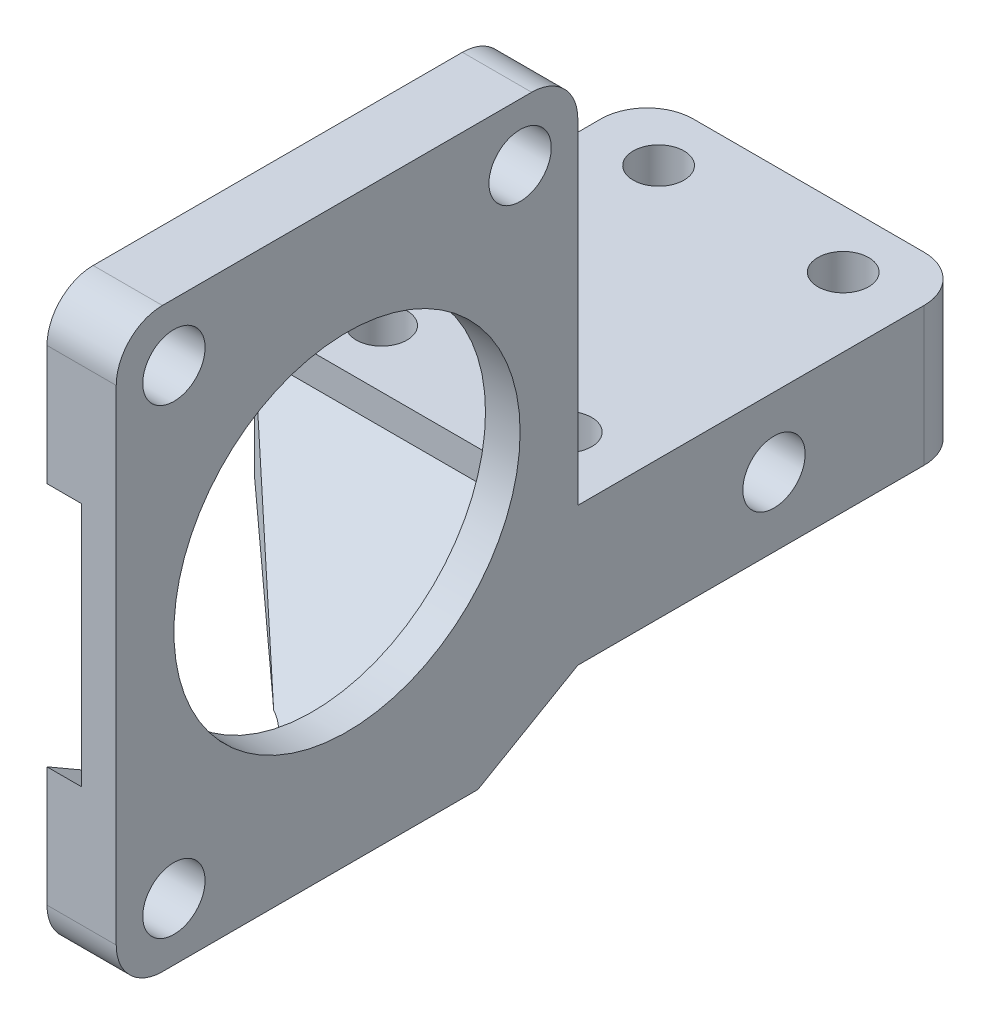
ISO-10303-21;
HEADER;
FILE_DESCRIPTION(('STEP AP214'),'2;1');
FILE_NAME('part.step','',(''),(''),'','','');
FILE_SCHEMA(('AUTOMOTIVE_DESIGN { 1 0 10303 214 1 1 1 1 }'));
ENDSEC;
DATA;
#1=APPLICATION_CONTEXT('core data for automotive mechanical design processes');
#2=APPLICATION_PROTOCOL_DEFINITION('international standard','automotive_design',2000,#1);
#3=PRODUCT_CONTEXT('',#1,'mechanical');
#4=PRODUCT('Part','Part','',(#3));
#5=PRODUCT_RELATED_PRODUCT_CATEGORY('part','',(#4));
#6=PRODUCT_DEFINITION_FORMATION('','',#4);
#7=PRODUCT_DEFINITION_CONTEXT('part definition',#1,'design');
#8=PRODUCT_DEFINITION('design','',#6,#7);
#9=PRODUCT_DEFINITION_SHAPE('','',#8);
#10=(LENGTH_UNIT() NAMED_UNIT(*) SI_UNIT(.MILLI.,.METRE.));
#11=(NAMED_UNIT(*) PLANE_ANGLE_UNIT() SI_UNIT($,.RADIAN.));
#12=(NAMED_UNIT(*) SI_UNIT($,.STERADIAN.) SOLID_ANGLE_UNIT());
#13=UNCERTAINTY_MEASURE_WITH_UNIT(LENGTH_MEASURE(1.E-05),#10,'distance_accuracy_value','');
#14=(GEOMETRIC_REPRESENTATION_CONTEXT(3) GLOBAL_UNCERTAINTY_ASSIGNED_CONTEXT((#13)) GLOBAL_UNIT_ASSIGNED_CONTEXT((#10,
#11,#12)) REPRESENTATION_CONTEXT('',''));
#15=CARTESIAN_POINT('',(0.,0.,0.));
#16=DIRECTION('',(0.,0.,1.));
#17=DIRECTION('',(1.,0.,0.));
#18=AXIS2_PLACEMENT_3D('',#15,#16,#17);
#19=CARTESIAN_POINT('',(0.,6.,0.));
#20=DIRECTION('',(0.,-1.,0.));
#21=DIRECTION('',(0.,0.,-1.));
#22=AXIS2_PLACEMENT_3D('',#19,#20,#21);
#23=PLANE('',#22);
#24=CARTESIAN_POINT('',(-4.,6.,6.));
#25=DIRECTION('',(0.,1.,0.));
#26=DIRECTION('',(0.,0.,-1.));
#27=AXIS2_PLACEMENT_3D('',#24,#25,#26);
#28=CIRCLE('',#27,1.1);
#29=CARTESIAN_POINT('',(-4.,6.,4.9));
#30=VERTEX_POINT('',#29);
#31=EDGE_CURVE('E321',#30,#30,#28,.T.);
#32=ORIENTED_EDGE('',*,*,#31,.F.);
#33=EDGE_LOOP('',(#32));
#34=FACE_BOUND('',#33,.T.);
#35=CARTESIAN_POINT('',(4.,6.,6.));
#36=DIRECTION('',(0.,1.,0.));
#37=DIRECTION('',(0.,0.,1.));
#38=AXIS2_PLACEMENT_3D('',#35,#36,#37);
#39=CIRCLE('',#38,1.1);
#40=CARTESIAN_POINT('',(4.,6.,7.1));
#41=VERTEX_POINT('',#40);
#42=EDGE_CURVE('E327',#41,#41,#39,.T.);
#43=ORIENTED_EDGE('',*,*,#42,.F.);
#44=EDGE_LOOP('',(#43));
#45=FACE_BOUND('',#44,.T.);
#46=CARTESIAN_POINT('',(4.,6.,-6.));
#47=DIRECTION('',(0.,1.,0.));
#48=DIRECTION('',(0.,0.,-1.));
#49=AXIS2_PLACEMENT_3D('',#46,#47,#48);
#50=CIRCLE('',#49,1.1);
#51=CARTESIAN_POINT('',(4.,6.,-7.1));
#52=VERTEX_POINT('',#51);
#53=EDGE_CURVE('E333',#52,#52,#50,.T.);
#54=ORIENTED_EDGE('',*,*,#53,.F.);
#55=EDGE_LOOP('',(#54));
#56=FACE_BOUND('',#55,.T.);
#57=CARTESIAN_POINT('',(-4.,6.,-6.));
#58=DIRECTION('',(0.,1.,0.));
#59=DIRECTION('',(0.,0.,1.));
#60=AXIS2_PLACEMENT_3D('',#57,#58,#59);
#61=CIRCLE('',#60,1.1);
#62=CARTESIAN_POINT('',(-4.,6.,-4.9));
#63=VERTEX_POINT('',#62);
#64=EDGE_CURVE('E207',#63,#63,#61,.T.);
#65=ORIENTED_EDGE('',*,*,#64,.F.);
#66=EDGE_LOOP('',(#65));
#67=FACE_BOUND('',#66,.T.);
#68=DIRECTION('',(0.,0.,-1.));
#69=VECTOR('',#68,1.);
#70=CARTESIAN_POINT('',(7.,6.,8.5));
#71=LINE('',#70,#69);
#72=CARTESIAN_POINT('',(7.,6.,8.5));
#73=VERTEX_POINT('',#72);
#74=CARTESIAN_POINT('',(7.,6.,-6.5));
#75=VERTEX_POINT('',#74);
#76=EDGE_CURVE('E190',#73,#75,#71,.T.);
#77=ORIENTED_EDGE('',*,*,#76,.T.);
#78=CARTESIAN_POINT('',(5.,6.,-6.5));
#79=DIRECTION('',(0.,-1.,0.));
#80=DIRECTION('',(0.,0.,-1.));
#81=AXIS2_PLACEMENT_3D('',#78,#79,#80);
#82=CIRCLE('',#81,2.);
#83=CARTESIAN_POINT('',(5.,6.,-8.5));
#84=VERTEX_POINT('',#83);
#85=EDGE_CURVE('E255',#75,#84,#82,.F.);
#86=ORIENTED_EDGE('',*,*,#85,.T.);
#87=DIRECTION('',(-1.,0.,0.));
#88=VECTOR('',#87,1.);
#89=CARTESIAN_POINT('',(-7.,6.,-8.5));
#90=LINE('',#89,#88);
#91=CARTESIAN_POINT('',(-5.,6.,-8.5));
#92=VERTEX_POINT('',#91);
#93=EDGE_CURVE('E342',#84,#92,#90,.T.);
#94=ORIENTED_EDGE('',*,*,#93,.T.);
#95=CARTESIAN_POINT('',(-5.,6.,-6.5));
#96=DIRECTION('',(0.,-1.,0.));
#97=DIRECTION('',(0.,0.,-1.));
#98=AXIS2_PLACEMENT_3D('',#95,#96,#97);
#99=CIRCLE('',#98,2.);
#100=CARTESIAN_POINT('',(-7.,6.,-6.5));
#101=VERTEX_POINT('',#100);
#102=EDGE_CURVE('E253',#92,#101,#99,.F.);
#103=ORIENTED_EDGE('',*,*,#102,.T.);
#104=DIRECTION('',(0.,0.,1.));
#105=VECTOR('',#104,1.);
#106=CARTESIAN_POINT('',(-7.,6.,8.5));
#107=LINE('',#106,#105);
#108=CARTESIAN_POINT('',(-7.,6.,8.5));
#109=VERTEX_POINT('',#108);
#110=EDGE_CURVE('E344',#101,#109,#107,.T.);
#111=ORIENTED_EDGE('',*,*,#110,.T.);
#112=DIRECTION('',(1.,0.,0.));
#113=VECTOR('',#112,1.);
#114=CARTESIAN_POINT('',(-7.,6.,8.5));
#115=LINE('',#114,#113);
#116=CARTESIAN_POINT('',(5.5,6.,8.5));
#117=VERTEX_POINT('',#116);
#118=EDGE_CURVE('E215',#109,#117,#115,.T.);
#119=ORIENTED_EDGE('',*,*,#118,.T.);
#120=EDGE_CURVE('E345',#117,#73,#115,.T.);
#121=ORIENTED_EDGE('',*,*,#120,.T.);
#122=EDGE_LOOP('',(#77,#86,#94,#103,#111,#119,#121));
#123=FACE_BOUND('',#122,.T.);
#124=ADVANCED_FACE('F34',(#34,#45,#56,#67,#123),#23,.F.);
#125=CARTESIAN_POINT('',(0.,0.,0.));
#126=DIRECTION('',(0.,-1.,0.));
#127=DIRECTION('',(0.,0.,-1.));
#128=AXIS2_PLACEMENT_3D('',#125,#126,#127);
#129=PLANE('',#128);
#130=CARTESIAN_POINT('',(4.,0.,6.));
#131=DIRECTION('',(0.,1.,0.));
#132=DIRECTION('',(0.,0.,1.));
#133=AXIS2_PLACEMENT_3D('',#130,#131,#132);
#134=CIRCLE('',#133,1.1);
#135=CARTESIAN_POINT('',(4.,0.,7.1));
#136=VERTEX_POINT('',#135);
#137=EDGE_CURVE('E324',#136,#136,#134,.T.);
#138=ORIENTED_EDGE('',*,*,#137,.T.);
#139=EDGE_LOOP('',(#138));
#140=FACE_BOUND('',#139,.T.);
#141=CARTESIAN_POINT('',(-4.,0.,-6.));
#142=DIRECTION('',(0.,1.,0.));
#143=DIRECTION('',(0.,0.,1.));
#144=AXIS2_PLACEMENT_3D('',#141,#142,#143);
#145=CIRCLE('',#144,1.1);
#146=CARTESIAN_POINT('',(-4.,0.,-4.9));
#147=VERTEX_POINT('',#146);
#148=EDGE_CURVE('E212',#147,#147,#145,.T.);
#149=ORIENTED_EDGE('',*,*,#148,.T.);
#150=EDGE_LOOP('',(#149));
#151=FACE_BOUND('',#150,.T.);
#152=CARTESIAN_POINT('',(4.,0.,-6.));
#153=DIRECTION('',(0.,1.,0.));
#154=DIRECTION('',(0.,0.,-1.));
#155=AXIS2_PLACEMENT_3D('',#152,#153,#154);
#156=CIRCLE('',#155,1.1);
#157=CARTESIAN_POINT('',(4.,0.,-7.1));
#158=VERTEX_POINT('',#157);
#159=EDGE_CURVE('E330',#158,#158,#156,.T.);
#160=ORIENTED_EDGE('',*,*,#159,.T.);
#161=EDGE_LOOP('',(#160));
#162=FACE_BOUND('',#161,.T.);
#163=CARTESIAN_POINT('',(-4.,0.,6.));
#164=DIRECTION('',(0.,1.,0.));
#165=DIRECTION('',(0.,0.,-1.));
#166=AXIS2_PLACEMENT_3D('',#163,#164,#165);
#167=CIRCLE('',#166,1.1);
#168=CARTESIAN_POINT('',(-4.,0.,4.9));
#169=VERTEX_POINT('',#168);
#170=EDGE_CURVE('E302',#169,#169,#167,.T.);
#171=ORIENTED_EDGE('',*,*,#170,.T.);
#172=EDGE_LOOP('',(#171));
#173=FACE_BOUND('',#172,.T.);
#174=DIRECTION('',(1.,0.,0.));
#175=VECTOR('',#174,1.);
#176=CARTESIAN_POINT('',(-7.,0.,8.5));
#177=LINE('',#176,#175);
#178=CARTESIAN_POINT('',(1.5,0.,8.5));
#179=VERTEX_POINT('',#178);
#180=CARTESIAN_POINT('',(7.,0.,8.5));
#181=VERTEX_POINT('',#180);
#182=EDGE_CURVE('E179',#179,#181,#177,.T.);
#183=ORIENTED_EDGE('',*,*,#182,.F.);
#184=DIRECTION('',(0.,0.,1.));
#185=VECTOR('',#184,1.);
#186=CARTESIAN_POINT('',(1.5,0.,16.6205080756888));
#187=LINE('',#186,#185);
#188=CARTESIAN_POINT('',(1.5,0.,16.2272727272727));
#189=VERTEX_POINT('',#188);
#190=EDGE_CURVE('E281',#179,#189,#187,.T.);
#191=ORIENTED_EDGE('',*,*,#190,.T.);
#192=DIRECTION('',(-0.739940073395944,0.,-0.672672793996313));
#193=VECTOR('',#192,1.);
#194=CARTESIAN_POINT('',(-7.,0.,8.5));
#195=LINE('',#194,#193);
#196=CARTESIAN_POINT('',(-7.,0.,8.5));
#197=VERTEX_POINT('',#196);
#198=EDGE_CURVE('E228',#189,#197,#195,.T.);
#199=ORIENTED_EDGE('',*,*,#198,.T.);
#200=DIRECTION('',(0.,0.,1.));
#201=VECTOR('',#200,1.);
#202=CARTESIAN_POINT('',(-7.,0.,8.5));
#203=LINE('',#202,#201);
#204=CARTESIAN_POINT('',(-7.,0.,-6.5));
#205=VERTEX_POINT('',#204);
#206=EDGE_CURVE('E191',#205,#197,#203,.T.);
#207=ORIENTED_EDGE('',*,*,#206,.F.);
#208=CARTESIAN_POINT('',(-5.,0.,-6.5));
#209=DIRECTION('',(0.,-1.,0.));
#210=DIRECTION('',(0.,0.,-1.));
#211=AXIS2_PLACEMENT_3D('',#208,#209,#210);
#212=CIRCLE('',#211,2.);
#213=CARTESIAN_POINT('',(-5.,0.,-8.5));
#214=VERTEX_POINT('',#213);
#215=EDGE_CURVE('E242',#205,#214,#212,.T.);
#216=ORIENTED_EDGE('',*,*,#215,.T.);
#217=DIRECTION('',(-1.,0.,0.));
#218=VECTOR('',#217,1.);
#219=CARTESIAN_POINT('',(-7.,0.,-8.5));
#220=LINE('',#219,#218);
#221=CARTESIAN_POINT('',(5.,0.,-8.5));
#222=VERTEX_POINT('',#221);
#223=EDGE_CURVE('E206',#222,#214,#220,.T.);
#224=ORIENTED_EDGE('',*,*,#223,.F.);
#225=CARTESIAN_POINT('',(5.,0.,-6.5));
#226=DIRECTION('',(0.,-1.,0.));
#227=DIRECTION('',(0.,0.,-1.));
#228=AXIS2_PLACEMENT_3D('',#225,#226,#227);
#229=CIRCLE('',#228,2.);
#230=CARTESIAN_POINT('',(7.,0.,-6.5));
#231=VERTEX_POINT('',#230);
#232=EDGE_CURVE('E205',#222,#231,#229,.T.);
#233=ORIENTED_EDGE('',*,*,#232,.T.);
#234=DIRECTION('',(0.,0.,-1.));
#235=VECTOR('',#234,1.);
#236=CARTESIAN_POINT('',(7.,0.,8.5));
#237=LINE('',#236,#235);
#238=EDGE_CURVE('E197',#181,#231,#237,.T.);
#239=ORIENTED_EDGE('',*,*,#238,.F.);
#240=EDGE_LOOP('',(#183,#191,#199,#207,#216,#224,#233,#239));
#241=FACE_BOUND('',#240,.T.);
#242=ADVANCED_FACE('F203',(#140,#151,#162,#173,#241),#129,.T.);
#243=CARTESIAN_POINT('',(4.,-2.5,8.5));
#244=DIRECTION('',(0.,0.,-1.));
#245=DIRECTION('',(-1.,0.,0.));
#246=AXIS2_PLACEMENT_3D('',#243,#244,#245);
#247=PLANE('',#246);
#248=DIRECTION('',(0.,1.,0.));
#249=VECTOR('',#248,1.);
#250=CARTESIAN_POINT('',(4.,-2.5,8.5));
#251=LINE('',#250,#249);
#252=CARTESIAN_POINT('',(4.,15.3116224765446,8.5));
#253=VERTEX_POINT('',#252);
#254=CARTESIAN_POINT('',(4.,20.5,8.5));
#255=VERTEX_POINT('',#254);
#256=EDGE_CURVE('E320',#253,#255,#251,.T.);
#257=ORIENTED_EDGE('',*,*,#256,.T.);
#258=DIRECTION('',(1.,0.,0.));
#259=VECTOR('',#258,1.);
#260=CARTESIAN_POINT('',(4.,20.5,8.5));
#261=LINE('',#260,#259);
#262=CARTESIAN_POINT('',(7.,20.5,8.5));
#263=VERTEX_POINT('',#262);
#264=EDGE_CURVE('E278',#255,#263,#261,.T.);
#265=ORIENTED_EDGE('',*,*,#264,.T.);
#266=DIRECTION('',(0.,1.,0.));
#267=VECTOR('',#266,1.);
#268=CARTESIAN_POINT('',(7.,-2.5,8.5));
#269=LINE('',#268,#267);
#270=EDGE_CURVE('E309',#73,#263,#269,.T.);
#271=ORIENTED_EDGE('',*,*,#270,.F.);
#272=ORIENTED_EDGE('',*,*,#120,.F.);
#273=DIRECTION('',(0.,-1.,0.));
#274=VECTOR('',#273,1.);
#275=CARTESIAN_POINT('',(5.5,15.3116224765446,8.5));
#276=LINE('',#275,#274);
#277=CARTESIAN_POINT('',(5.5,15.3116224765446,8.5));
#278=VERTEX_POINT('',#277);
#279=EDGE_CURVE('E420',#278,#117,#276,.T.);
#280=ORIENTED_EDGE('',*,*,#279,.F.);
#281=DIRECTION('',(1.,0.,0.));
#282=VECTOR('',#281,1.);
#283=CARTESIAN_POINT('',(-7.,15.3116224765446,8.5));
#284=LINE('',#283,#282);
#285=EDGE_CURVE('E435',#253,#278,#284,.T.);
#286=ORIENTED_EDGE('',*,*,#285,.F.);
#287=EDGE_LOOP('',(#257,#265,#271,#272,#280,#286));
#288=FACE_BOUND('',#287,.T.);
#289=ADVANCED_FACE('F453',(#288),#247,.T.);
#290=CARTESIAN_POINT('',(4.,-2.5,28.5));
#291=DIRECTION('',(0.,0.,1.));
#292=DIRECTION('',(0.,-1.,0.));
#293=AXIS2_PLACEMENT_3D('',#290,#291,#292);
#294=PLANE('',#293);
#295=DIRECTION('',(0.,-1.,0.));
#296=VECTOR('',#295,1.);
#297=CARTESIAN_POINT('',(4.,-2.5,28.5));
#298=LINE('',#297,#296);
#299=CARTESIAN_POINT('',(4.,4.68837752345546,28.5));
#300=VERTEX_POINT('',#299);
#301=CARTESIAN_POINT('',(4.,-0.500000000000002,28.5));
#302=VERTEX_POINT('',#301);
#303=EDGE_CURVE('E305',#300,#302,#298,.T.);
#304=ORIENTED_EDGE('',*,*,#303,.T.);
#305=DIRECTION('',(1.,0.,0.));
#306=VECTOR('',#305,1.);
#307=CARTESIAN_POINT('',(4.,-0.500000000000002,28.5));
#308=LINE('',#307,#306);
#309=CARTESIAN_POINT('',(7.,-0.500000000000002,28.5));
#310=VERTEX_POINT('',#309);
#311=EDGE_CURVE('E262',#302,#310,#308,.T.);
#312=ORIENTED_EDGE('',*,*,#311,.T.);
#313=DIRECTION('',(0.,-1.,0.));
#314=VECTOR('',#313,1.);
#315=CARTESIAN_POINT('',(7.,-2.5,28.5));
#316=LINE('',#315,#314);
#317=CARTESIAN_POINT('',(7.,20.5,28.5));
#318=VERTEX_POINT('',#317);
#319=EDGE_CURVE('E316',#318,#310,#316,.T.);
#320=ORIENTED_EDGE('',*,*,#319,.F.);
#321=DIRECTION('',(1.,0.,0.));
#322=VECTOR('',#321,1.);
#323=CARTESIAN_POINT('',(4.,20.5,28.5));
#324=LINE('',#323,#322);
#325=CARTESIAN_POINT('',(4.,20.5,28.5));
#326=VERTEX_POINT('',#325);
#327=EDGE_CURVE('E260',#318,#326,#324,.F.);
#328=ORIENTED_EDGE('',*,*,#327,.T.);
#329=CARTESIAN_POINT('',(4.,15.3116224765446,28.5));
#330=VERTEX_POINT('',#329);
#331=EDGE_CURVE('E304',#326,#330,#298,.T.);
#332=ORIENTED_EDGE('',*,*,#331,.T.);
#333=DIRECTION('',(1.,0.,0.));
#334=VECTOR('',#333,1.);
#335=CARTESIAN_POINT('',(-7.,15.3116224765446,28.5));
#336=LINE('',#335,#334);
#337=CARTESIAN_POINT('',(5.5,15.3116224765446,28.5));
#338=VERTEX_POINT('',#337);
#339=EDGE_CURVE('E229',#330,#338,#336,.T.);
#340=ORIENTED_EDGE('',*,*,#339,.T.);
#341=DIRECTION('',(0.,1.,0.));
#342=VECTOR('',#341,1.);
#343=CARTESIAN_POINT('',(5.5,15.3116224765446,28.5));
#344=LINE('',#343,#342);
#345=CARTESIAN_POINT('',(5.5,4.68837752345546,28.5));
#346=VERTEX_POINT('',#345);
#347=EDGE_CURVE('E408',#346,#338,#344,.T.);
#348=ORIENTED_EDGE('',*,*,#347,.F.);
#349=DIRECTION('',(1.,0.,0.));
#350=VECTOR('',#349,1.);
#351=CARTESIAN_POINT('',(-7.,4.68837752345546,28.5));
#352=LINE('',#351,#350);
#353=EDGE_CURVE('E405',#300,#346,#352,.T.);
#354=ORIENTED_EDGE('',*,*,#353,.F.);
#355=EDGE_LOOP('',(#304,#312,#320,#328,#332,#340,#348,#354));
#356=FACE_BOUND('',#355,.T.);
#357=ADVANCED_FACE('F402',(#356),#294,.T.);
#358=CARTESIAN_POINT('',(4.,0.,0.));
#359=DIRECTION('',(-1.,0.,0.));
#360=DIRECTION('',(0.,0.,1.));
#361=AXIS2_PLACEMENT_3D('',#358,#359,#360);
#362=PLANE('',#361);
#363=CARTESIAN_POINT('',(4.,20.,11.));
#364=DIRECTION('',(1.,0.,0.));
#365=DIRECTION('',(0.,0.,1.));
#366=AXIS2_PLACEMENT_3D('',#363,#364,#365);
#367=CIRCLE('',#366,1.35);
#368=CARTESIAN_POINT('',(4.,20.,12.35));
#369=VERTEX_POINT('',#368);
#370=EDGE_CURVE('E379',#369,#369,#367,.T.);
#371=ORIENTED_EDGE('',*,*,#370,.T.);
#372=EDGE_LOOP('',(#371));
#373=FACE_BOUND('',#372,.T.);
#374=CARTESIAN_POINT('',(4.,20.,26.));
#375=DIRECTION('',(1.,0.,0.));
#376=DIRECTION('',(0.,0.,-1.));
#377=AXIS2_PLACEMENT_3D('',#374,#375,#376);
#378=CIRCLE('',#377,1.35);
#379=CARTESIAN_POINT('',(4.,20.,24.65));
#380=VERTEX_POINT('',#379);
#381=EDGE_CURVE('E385',#380,#380,#378,.T.);
#382=ORIENTED_EDGE('',*,*,#381,.T.);
#383=EDGE_LOOP('',(#382));
#384=FACE_BOUND('',#383,.T.);
#385=ORIENTED_EDGE('',*,*,#331,.F.);
#386=CARTESIAN_POINT('',(4.,20.5,26.5));
#387=DIRECTION('',(-1.,0.,0.));
#388=DIRECTION('',(0.,0.,1.));
#389=AXIS2_PLACEMENT_3D('',#386,#387,#388);
#390=CIRCLE('',#389,2.);
#391=CARTESIAN_POINT('',(4.,22.5,26.5));
#392=VERTEX_POINT('',#391);
#393=EDGE_CURVE('E276',#326,#392,#390,.T.);
#394=ORIENTED_EDGE('',*,*,#393,.T.);
#395=DIRECTION('',(0.,0.,1.));
#396=VECTOR('',#395,1.);
#397=CARTESIAN_POINT('',(4.,22.5,28.5));
#398=LINE('',#397,#396);
#399=CARTESIAN_POINT('',(4.,22.5,10.5));
#400=VERTEX_POINT('',#399);
#401=EDGE_CURVE('E393',#400,#392,#398,.T.);
#402=ORIENTED_EDGE('',*,*,#401,.F.);
#403=CARTESIAN_POINT('',(4.,20.5,10.5));
#404=DIRECTION('',(-1.,0.,0.));
#405=DIRECTION('',(0.,0.,1.));
#406=AXIS2_PLACEMENT_3D('',#403,#404,#405);
#407=CIRCLE('',#406,2.);
#408=EDGE_CURVE('E274',#400,#255,#407,.T.);
#409=ORIENTED_EDGE('',*,*,#408,.T.);
#410=ORIENTED_EDGE('',*,*,#256,.F.);
#411=DIRECTION('',(0.,0.499999999999994,0.866025403784442));
#412=VECTOR('',#411,1.);
#413=CARTESIAN_POINT('',(4.,7.80310889132468,-4.5051270189222));
#414=LINE('',#413,#412);
#415=CARTESIAN_POINT('',(4.,21.0851251684408,18.5));
#416=VERTEX_POINT('',#415);
#417=EDGE_CURVE('E231',#253,#416,#414,.T.);
#418=ORIENTED_EDGE('',*,*,#417,.T.);
#419=DIRECTION('',(0.,-0.5,0.866025403784439));
#420=VECTOR('',#419,1.);
#421=CARTESIAN_POINT('',(4.,23.8245788613367,13.7551270189222));
#422=LINE('',#421,#420);
#423=EDGE_CURVE('E234',#416,#330,#422,.T.);
#424=ORIENTED_EDGE('',*,*,#423,.T.);
#425=EDGE_LOOP('',(#385,#394,#402,#409,#410,#418,#424));
#426=FACE_BOUND('',#425,.T.);
#427=ADVANCED_FACE('F444',(#373,#384,#426),#362,.T.);
#428=DIRECTION('',(0.,-0.500000000000018,-0.866025403784428));
#429=VECTOR('',#428,1.);
#430=CARTESIAN_POINT('',(4.,-8.82457886133705,5.09487298107827));
#431=LINE('',#430,#429);
#432=CARTESIAN_POINT('',(4.,-1.08512516844081,18.5));
#433=VERTEX_POINT('',#432);
#434=EDGE_CURVE('E224',#300,#433,#431,.T.);
#435=ORIENTED_EDGE('',*,*,#434,.T.);
#436=DIRECTION('',(0.,-0.5,0.866025403784439));
#437=VECTOR('',#436,1.);
#438=CARTESIAN_POINT('',(4.,4.45743741577959,8.9));
#439=LINE('',#438,#437);
#440=CARTESIAN_POINT('',(4.,-2.5,20.950635094611));
#441=VERTEX_POINT('',#440);
#442=EDGE_CURVE('E49',#433,#441,#439,.T.);
#443=ORIENTED_EDGE('',*,*,#442,.T.);
#444=DIRECTION('',(0.,0.,-1.));
#445=VECTOR('',#444,1.);
#446=CARTESIAN_POINT('',(4.,-2.5,28.5));
#447=LINE('',#446,#445);
#448=CARTESIAN_POINT('',(4.,-2.5,26.5));
#449=VERTEX_POINT('',#448);
#450=EDGE_CURVE('E294',#449,#441,#447,.T.);
#451=ORIENTED_EDGE('',*,*,#450,.F.);
#452=CARTESIAN_POINT('',(4.,-0.500000000000001,26.5));
#453=DIRECTION('',(-1.,0.,0.));
#454=DIRECTION('',(0.,0.,1.));
#455=AXIS2_PLACEMENT_3D('',#452,#453,#454);
#456=CIRCLE('',#455,2.);
#457=EDGE_CURVE('E267',#449,#302,#456,.T.);
#458=ORIENTED_EDGE('',*,*,#457,.T.);
#459=ORIENTED_EDGE('',*,*,#303,.F.);
#460=EDGE_LOOP('',(#435,#443,#451,#458,#459));
#461=FACE_BOUND('',#460,.T.);
#462=CARTESIAN_POINT('',(4.,0.,26.));
#463=DIRECTION('',(1.,0.,0.));
#464=DIRECTION('',(0.,0.,1.));
#465=AXIS2_PLACEMENT_3D('',#462,#463,#464);
#466=CIRCLE('',#465,1.35);
#467=CARTESIAN_POINT('',(4.,0.,27.35));
#468=VERTEX_POINT('',#467);
#469=EDGE_CURVE('E373',#468,#468,#466,.T.);
#470=ORIENTED_EDGE('',*,*,#469,.T.);
#471=EDGE_LOOP('',(#470));
#472=FACE_BOUND('',#471,.T.);
#473=ADVANCED_FACE('F292',(#461,#472),#362,.T.);
#474=CARTESIAN_POINT('',(-7.,20.8660687473185,8.5));
#475=DIRECTION('',(-0.672672793996313,0.,0.739940073395943));
#476=DIRECTION('',(0.739940073395944,0.,0.672672793996313));
#477=AXIS2_PLACEMENT_3D('',#474,#475,#476);
#478=PLANE('',#477);
#479=ORIENTED_EDGE('',*,*,#198,.F.);
#480=CARTESIAN_POINT('',(1.5,-2.5,16.2272727272727));
#481=DIRECTION('',(-0.672672793996313,0.,0.739940073395943));
#482=DIRECTION('',(-0.739940073395944,0.,-0.672672793996313));
#483=AXIS2_PLACEMENT_3D('',#480,#481,#482);
#484=ELLIPSE('',#483,3.37865198802693,2.5);
#485=CARTESIAN_POINT('',(2.04869741282572,-0.0609569193721965,16.7260885571143));
#486=VERTEX_POINT('',#485);
#487=EDGE_CURVE('E284',#189,#486,#484,.F.);
#488=ORIENTED_EDGE('',*,*,#487,.T.);
#489=DIRECTION('',(-0.689748942872674,0.362024307127999,-0.627044493520613));
#490=VECTOR('',#489,1.);
#491=CARTESIAN_POINT('',(-11.0396646741522,6.80865160259871,4.82757756895256));
#492=LINE('',#491,#490);
#493=CARTESIAN_POINT('',(-7.,4.68837752345545,8.5));
#494=VERTEX_POINT('',#493);
#495=EDGE_CURVE('E55',#486,#494,#492,.T.);
#496=ORIENTED_EDGE('',*,*,#495,.T.);
#497=DIRECTION('',(0.,-1.,0.));
#498=VECTOR('',#497,1.);
#499=CARTESIAN_POINT('',(-7.,6.,8.5));
#500=LINE('',#499,#498);
#501=EDGE_CURVE('E222',#494,#197,#500,.T.);
#502=ORIENTED_EDGE('',*,*,#501,.T.);
#503=EDGE_LOOP('',(#479,#488,#496,#502));
#504=FACE_BOUND('',#503,.T.);
#505=ADVANCED_FACE('F356',(#504),#478,.T.);
#506=CARTESIAN_POINT('',(7.,6.,8.5));
#507=DIRECTION('',(-1.,0.,0.));
#508=DIRECTION('',(0.,0.,1.));
#509=AXIS2_PLACEMENT_3D('',#506,#507,#508);
#510=PLANE('',#509);
#511=CARTESIAN_POINT('',(7.,3.,0.));
#512=DIRECTION('',(1.,0.,0.));
#513=DIRECTION('',(0.,0.,1.));
#514=AXIS2_PLACEMENT_3D('',#511,#512,#513);
#515=CIRCLE('',#514,1.35);
#516=CARTESIAN_POINT('',(7.,3.,1.35));
#517=VERTEX_POINT('',#516);
#518=EDGE_CURVE('E362',#517,#517,#515,.T.);
#519=ORIENTED_EDGE('',*,*,#518,.F.);
#520=EDGE_LOOP('',(#519));
#521=FACE_BOUND('',#520,.T.);
#522=ORIENTED_EDGE('',*,*,#238,.T.);
#523=DIRECTION('',(0.,-1.,0.));
#524=VECTOR('',#523,1.);
#525=CARTESIAN_POINT('',(7.,6.,-6.5));
#526=LINE('',#525,#524);
#527=EDGE_CURVE('E251',#231,#75,#526,.F.);
#528=ORIENTED_EDGE('',*,*,#527,.T.);
#529=ORIENTED_EDGE('',*,*,#76,.F.);
#530=ORIENTED_EDGE('',*,*,#270,.T.);
#531=CARTESIAN_POINT('',(7.,20.5,10.5));
#532=DIRECTION('',(-1.,0.,0.));
#533=DIRECTION('',(0.,0.,1.));
#534=AXIS2_PLACEMENT_3D('',#531,#532,#533);
#535=CIRCLE('',#534,2.);
#536=CARTESIAN_POINT('',(7.,22.5,10.5));
#537=VERTEX_POINT('',#536);
#538=EDGE_CURVE('E245',#263,#537,#535,.F.);
#539=ORIENTED_EDGE('',*,*,#538,.T.);
#540=DIRECTION('',(0.,0.,1.));
#541=VECTOR('',#540,1.);
#542=CARTESIAN_POINT('',(7.,22.5,28.5));
#543=LINE('',#542,#541);
#544=CARTESIAN_POINT('',(7.,22.5,26.5));
#545=VERTEX_POINT('',#544);
#546=EDGE_CURVE('E312',#537,#545,#543,.T.);
#547=ORIENTED_EDGE('',*,*,#546,.T.);
#548=CARTESIAN_POINT('',(7.,20.5,26.5));
#549=DIRECTION('',(-1.,0.,0.));
#550=DIRECTION('',(0.,0.,1.));
#551=AXIS2_PLACEMENT_3D('',#548,#549,#550);
#552=CIRCLE('',#551,2.);
#553=EDGE_CURVE('E247',#545,#318,#552,.F.);
#554=ORIENTED_EDGE('',*,*,#553,.T.);
#555=ORIENTED_EDGE('',*,*,#319,.T.);
#556=CARTESIAN_POINT('',(7.,-0.500000000000001,26.5));
#557=DIRECTION('',(-1.,0.,0.));
#558=DIRECTION('',(0.,0.,1.));
#559=AXIS2_PLACEMENT_3D('',#556,#557,#558);
#560=CIRCLE('',#559,2.);
#561=CARTESIAN_POINT('',(7.,-2.5,26.5));
#562=VERTEX_POINT('',#561);
#563=EDGE_CURVE('E249',#310,#562,#560,.F.);
#564=ORIENTED_EDGE('',*,*,#563,.T.);
#565=DIRECTION('',(0.,0.,-1.));
#566=VECTOR('',#565,1.);
#567=CARTESIAN_POINT('',(7.,-2.5,28.5));
#568=LINE('',#567,#566);
#569=CARTESIAN_POINT('',(7.,-2.5,12.8301270189222));
#570=VERTEX_POINT('',#569);
#571=EDGE_CURVE('E200',#562,#570,#568,.T.);
#572=ORIENTED_EDGE('',*,*,#571,.T.);
#573=DIRECTION('',(0.,0.5,-0.866025403784439));
#574=VECTOR('',#573,1.);
#575=CARTESIAN_POINT('',(7.,-2.5,12.8301270189222));
#576=LINE('',#575,#574);
#577=EDGE_CURVE('E183',#570,#181,#576,.T.);
#578=ORIENTED_EDGE('',*,*,#577,.T.);
#579=EDGE_LOOP('',(#522,#528,#529,#530,#539,#547,#554,#555,#564,#572,#578));
#580=FACE_BOUND('',#579,.T.);
#581=CARTESIAN_POINT('',(7.,0.,26.));
#582=DIRECTION('',(1.,0.,0.));
#583=DIRECTION('',(0.,0.,1.));
#584=AXIS2_PLACEMENT_3D('',#581,#582,#583);
#585=CIRCLE('',#584,1.35);
#586=CARTESIAN_POINT('',(7.,0.,27.35));
#587=VERTEX_POINT('',#586);
#588=EDGE_CURVE('E371',#587,#587,#585,.T.);
#589=ORIENTED_EDGE('',*,*,#588,.F.);
#590=EDGE_LOOP('',(#589));
#591=FACE_BOUND('',#590,.T.);
#592=CARTESIAN_POINT('',(7.,20.,11.));
#593=DIRECTION('',(1.,0.,0.));
#594=DIRECTION('',(0.,0.,1.));
#595=AXIS2_PLACEMENT_3D('',#592,#593,#594);
#596=CIRCLE('',#595,1.35);
#597=CARTESIAN_POINT('',(7.,20.,12.35));
#598=VERTEX_POINT('',#597);
#599=EDGE_CURVE('E376',#598,#598,#596,.T.);
#600=ORIENTED_EDGE('',*,*,#599,.F.);
#601=EDGE_LOOP('',(#600));
#602=FACE_BOUND('',#601,.T.);
#603=CARTESIAN_POINT('',(7.,20.,26.));
#604=DIRECTION('',(1.,0.,0.));
#605=DIRECTION('',(0.,0.,-1.));
#606=AXIS2_PLACEMENT_3D('',#603,#604,#605);
#607=CIRCLE('',#606,1.35);
#608=CARTESIAN_POINT('',(7.,20.,24.65));
#609=VERTEX_POINT('',#608);
#610=EDGE_CURVE('E382',#609,#609,#607,.T.);
#611=ORIENTED_EDGE('',*,*,#610,.F.);
#612=EDGE_LOOP('',(#611));
#613=FACE_BOUND('',#612,.T.);
#614=CARTESIAN_POINT('',(7.,10.,18.5));
#615=DIRECTION('',(1.,0.,0.));
#616=DIRECTION('',(0.,0.,-1.));
#617=AXIS2_PLACEMENT_3D('',#614,#615,#616);
#618=CIRCLE('',#617,7.5);
#619=CARTESIAN_POINT('',(7.,10.,11.));
#620=VERTEX_POINT('',#619);
#621=EDGE_CURVE('E313',#620,#620,#618,.T.);
#622=ORIENTED_EDGE('',*,*,#621,.F.);
#623=EDGE_LOOP('',(#622));
#624=FACE_BOUND('',#623,.T.);
#625=ADVANCED_FACE('F195',(#521,#580,#591,#602,#613,#624),#510,.F.);
#626=CARTESIAN_POINT('',(-7.,6.,-8.5));
#627=DIRECTION('',(0.,0.,1.));
#628=DIRECTION('',(1.,0.,0.));
#629=AXIS2_PLACEMENT_3D('',#626,#627,#628);
#630=PLANE('',#629);
#631=ORIENTED_EDGE('',*,*,#93,.F.);
#632=DIRECTION('',(0.,-1.,0.));
#633=VECTOR('',#632,1.);
#634=CARTESIAN_POINT('',(5.,6.,-8.5));
#635=LINE('',#634,#633);
#636=EDGE_CURVE('E239',#84,#222,#635,.T.);
#637=ORIENTED_EDGE('',*,*,#636,.T.);
#638=ORIENTED_EDGE('',*,*,#223,.T.);
#639=DIRECTION('',(0.,-1.,0.));
#640=VECTOR('',#639,1.);
#641=CARTESIAN_POINT('',(-5.,6.,-8.5));
#642=LINE('',#641,#640);
#643=EDGE_CURVE('E237',#214,#92,#642,.F.);
#644=ORIENTED_EDGE('',*,*,#643,.T.);
#645=EDGE_LOOP('',(#631,#637,#638,#644));
#646=FACE_BOUND('',#645,.T.);
#647=ADVANCED_FACE('F491',(#646),#630,.F.);
#648=CARTESIAN_POINT('',(-7.,6.,8.5));
#649=DIRECTION('',(1.,0.,0.));
#650=DIRECTION('',(0.,0.,-1.));
#651=AXIS2_PLACEMENT_3D('',#648,#649,#650);
#652=PLANE('',#651);
#653=CARTESIAN_POINT('',(-7.,3.,0.));
#654=DIRECTION('',(1.,0.,0.));
#655=DIRECTION('',(0.,0.,1.));
#656=AXIS2_PLACEMENT_3D('',#653,#654,#655);
#657=CIRCLE('',#656,1.35);
#658=CARTESIAN_POINT('',(-7.,3.,1.35));
#659=VERTEX_POINT('',#658);
#660=EDGE_CURVE('E365',#659,#659,#657,.T.);
#661=ORIENTED_EDGE('',*,*,#660,.T.);
#662=EDGE_LOOP('',(#661));
#663=FACE_BOUND('',#662,.T.);
#664=ORIENTED_EDGE('',*,*,#110,.F.);
#665=DIRECTION('',(0.,-1.,0.));
#666=VECTOR('',#665,1.);
#667=CARTESIAN_POINT('',(-7.,6.,-6.5));
#668=LINE('',#667,#666);
#669=EDGE_CURVE('E257',#101,#205,#668,.T.);
#670=ORIENTED_EDGE('',*,*,#669,.T.);
#671=ORIENTED_EDGE('',*,*,#206,.T.);
#672=ORIENTED_EDGE('',*,*,#501,.F.);
#673=EDGE_CURVE('E220',#109,#494,#500,.T.);
#674=ORIENTED_EDGE('',*,*,#673,.F.);
#675=EDGE_LOOP('',(#664,#670,#671,#672,#674));
#676=FACE_BOUND('',#675,.T.);
#677=ADVANCED_FACE('F359',(#663,#676),#652,.F.);
#678=CARTESIAN_POINT('',(-4.,6.,-6.));
#679=DIRECTION('',(0.,-1.,0.));
#680=DIRECTION('',(0.,0.,-1.));
#681=AXIS2_PLACEMENT_3D('',#678,#679,#680);
#682=CYLINDRICAL_SURFACE('',#681,1.1);
#683=ORIENTED_EDGE('',*,*,#64,.T.);
#684=EDGE_LOOP('',(#683));
#685=FACE_BOUND('',#684,.T.);
#686=ORIENTED_EDGE('',*,*,#148,.F.);
#687=EDGE_LOOP('',(#686));
#688=FACE_BOUND('',#687,.T.);
#689=ADVANCED_FACE('F486',(#685,#688),#682,.F.);
#690=CARTESIAN_POINT('',(4.,6.,-6.));
#691=DIRECTION('',(0.,-1.,0.));
#692=DIRECTION('',(0.,0.,-1.));
#693=AXIS2_PLACEMENT_3D('',#690,#691,#692);
#694=CYLINDRICAL_SURFACE('',#693,1.1);
#695=ORIENTED_EDGE('',*,*,#53,.T.);
#696=EDGE_LOOP('',(#695));
#697=FACE_BOUND('',#696,.T.);
#698=ORIENTED_EDGE('',*,*,#159,.F.);
#699=EDGE_LOOP('',(#698));
#700=FACE_BOUND('',#699,.T.);
#701=ADVANCED_FACE('F550',(#697,#700),#694,.F.);
#702=CARTESIAN_POINT('',(4.,6.,6.));
#703=DIRECTION('',(0.,-1.,0.));
#704=DIRECTION('',(0.,0.,-1.));
#705=AXIS2_PLACEMENT_3D('',#702,#703,#704);
#706=CYLINDRICAL_SURFACE('',#705,1.1);
#707=ORIENTED_EDGE('',*,*,#42,.T.);
#708=EDGE_LOOP('',(#707));
#709=FACE_BOUND('',#708,.T.);
#710=ORIENTED_EDGE('',*,*,#137,.F.);
#711=EDGE_LOOP('',(#710));
#712=FACE_BOUND('',#711,.T.);
#713=ADVANCED_FACE('F547',(#709,#712),#706,.F.);
#714=CARTESIAN_POINT('',(-4.,6.,6.));
#715=DIRECTION('',(0.,-1.,0.));
#716=DIRECTION('',(0.,0.,-1.));
#717=AXIS2_PLACEMENT_3D('',#714,#715,#716);
#718=CYLINDRICAL_SURFACE('',#717,1.1);
#719=ORIENTED_EDGE('',*,*,#31,.T.);
#720=EDGE_LOOP('',(#719));
#721=FACE_BOUND('',#720,.T.);
#722=ORIENTED_EDGE('',*,*,#170,.F.);
#723=EDGE_LOOP('',(#722));
#724=FACE_BOUND('',#723,.T.);
#725=ADVANCED_FACE('F539',(#721,#724),#718,.F.);
#726=CARTESIAN_POINT('',(4.,-2.5,28.5));
#727=DIRECTION('',(0.,-1.,0.));
#728=DIRECTION('',(0.,0.,-1.));
#729=AXIS2_PLACEMENT_3D('',#726,#727,#728);
#730=PLANE('',#729);
#731=ORIENTED_EDGE('',*,*,#571,.F.);
#732=DIRECTION('',(1.,0.,0.));
#733=VECTOR('',#732,1.);
#734=CARTESIAN_POINT('',(4.,-2.5,26.5));
#735=LINE('',#734,#733);
#736=EDGE_CURVE('E265',#562,#449,#735,.F.);
#737=ORIENTED_EDGE('',*,*,#736,.T.);
#738=ORIENTED_EDGE('',*,*,#450,.T.);
#739=CARTESIAN_POINT('',(4.,-2.5,12.8301270189222));
#740=VERTEX_POINT('',#739);
#741=EDGE_CURVE('E300',#441,#740,#447,.T.);
#742=ORIENTED_EDGE('',*,*,#741,.T.);
#743=DIRECTION('',(-1.,0.,0.));
#744=VECTOR('',#743,1.);
#745=CARTESIAN_POINT('',(7.,-2.5,12.8301270189222));
#746=LINE('',#745,#744);
#747=EDGE_CURVE('E201',#570,#740,#746,.T.);
#748=ORIENTED_EDGE('',*,*,#747,.F.);
#749=EDGE_LOOP('',(#731,#737,#738,#742,#748));
#750=FACE_BOUND('',#749,.T.);
#751=ADVANCED_FACE('F299',(#750),#730,.T.);
#752=CARTESIAN_POINT('',(4.,22.5,28.5));
#753=DIRECTION('',(0.,1.,0.));
#754=DIRECTION('',(0.,0.,1.));
#755=AXIS2_PLACEMENT_3D('',#752,#753,#754);
#756=PLANE('',#755);
#757=ORIENTED_EDGE('',*,*,#401,.T.);
#758=DIRECTION('',(1.,0.,0.));
#759=VECTOR('',#758,1.);
#760=CARTESIAN_POINT('',(4.,22.5,26.5));
#761=LINE('',#760,#759);
#762=EDGE_CURVE('E271',#392,#545,#761,.T.);
#763=ORIENTED_EDGE('',*,*,#762,.T.);
#764=ORIENTED_EDGE('',*,*,#546,.F.);
#765=DIRECTION('',(1.,0.,0.));
#766=VECTOR('',#765,1.);
#767=CARTESIAN_POINT('',(4.,22.5,10.5));
#768=LINE('',#767,#766);
#769=EDGE_CURVE('E269',#537,#400,#768,.F.);
#770=ORIENTED_EDGE('',*,*,#769,.T.);
#771=EDGE_LOOP('',(#757,#763,#764,#770));
#772=FACE_BOUND('',#771,.T.);
#773=ADVANCED_FACE('F522',(#772),#756,.T.);
#774=CARTESIAN_POINT('',(4.,10.,18.5));
#775=DIRECTION('',(1.,0.,0.));
#776=DIRECTION('',(0.,0.,-1.));
#777=AXIS2_PLACEMENT_3D('',#774,#775,#776);
#778=CYLINDRICAL_SURFACE('',#777,7.5);
#779=CARTESIAN_POINT('',(5.5,10.,18.5));
#780=DIRECTION('',(1.,0.,0.));
#781=DIRECTION('',(0.,0.,-1.));
#782=AXIS2_PLACEMENT_3D('',#779,#780,#781);
#783=CIRCLE('',#782,7.5);
#784=CARTESIAN_POINT('',(5.5,10.,11.));
#785=VERTEX_POINT('',#784);
#786=EDGE_CURVE('E225',#785,#785,#783,.F.);
#787=ORIENTED_EDGE('',*,*,#786,.T.);
#788=EDGE_LOOP('',(#787));
#789=FACE_BOUND('',#788,.T.);
#790=ORIENTED_EDGE('',*,*,#621,.T.);
#791=EDGE_LOOP('',(#790));
#792=FACE_BOUND('',#791,.T.);
#793=ADVANCED_FACE('F530',(#789,#792),#778,.F.);
#794=CARTESIAN_POINT('',(4.,20.,26.));
#795=DIRECTION('',(1.,0.,0.));
#796=DIRECTION('',(0.,0.,-1.));
#797=AXIS2_PLACEMENT_3D('',#794,#795,#796);
#798=CYLINDRICAL_SURFACE('',#797,1.35);
#799=ORIENTED_EDGE('',*,*,#381,.F.);
#800=EDGE_LOOP('',(#799));
#801=FACE_BOUND('',#800,.T.);
#802=ORIENTED_EDGE('',*,*,#610,.T.);
#803=EDGE_LOOP('',(#802));
#804=FACE_BOUND('',#803,.T.);
#805=ADVANCED_FACE('F536',(#801,#804),#798,.F.);
#806=CARTESIAN_POINT('',(4.,20.,11.));
#807=DIRECTION('',(1.,0.,0.));
#808=DIRECTION('',(0.,0.,-1.));
#809=AXIS2_PLACEMENT_3D('',#806,#807,#808);
#810=CYLINDRICAL_SURFACE('',#809,1.35);
#811=ORIENTED_EDGE('',*,*,#370,.F.);
#812=EDGE_LOOP('',(#811));
#813=FACE_BOUND('',#812,.T.);
#814=ORIENTED_EDGE('',*,*,#599,.T.);
#815=EDGE_LOOP('',(#814));
#816=FACE_BOUND('',#815,.T.);
#817=ADVANCED_FACE('F674',(#813,#816),#810,.F.);
#818=CARTESIAN_POINT('',(4.,0.,26.));
#819=DIRECTION('',(1.,0.,0.));
#820=DIRECTION('',(0.,0.,-1.));
#821=AXIS2_PLACEMENT_3D('',#818,#819,#820);
#822=CYLINDRICAL_SURFACE('',#821,1.35);
#823=ORIENTED_EDGE('',*,*,#469,.F.);
#824=EDGE_LOOP('',(#823));
#825=FACE_BOUND('',#824,.T.);
#826=ORIENTED_EDGE('',*,*,#588,.T.);
#827=EDGE_LOOP('',(#826));
#828=FACE_BOUND('',#827,.T.);
#829=ADVANCED_FACE('F684',(#825,#828),#822,.F.);
#830=CARTESIAN_POINT('',(-7.,3.,0.));
#831=DIRECTION('',(1.,0.,0.));
#832=DIRECTION('',(0.,0.,-1.));
#833=AXIS2_PLACEMENT_3D('',#830,#831,#832);
#834=CYLINDRICAL_SURFACE('',#833,1.35);
#835=ORIENTED_EDGE('',*,*,#660,.F.);
#836=EDGE_LOOP('',(#835));
#837=FACE_BOUND('',#836,.T.);
#838=ORIENTED_EDGE('',*,*,#518,.T.);
#839=EDGE_LOOP('',(#838));
#840=FACE_BOUND('',#839,.T.);
#841=ADVANCED_FACE('F471',(#837,#840),#834,.F.);
#842=CARTESIAN_POINT('',(5.5,0.,0.));
#843=DIRECTION('',(1.,0.,0.));
#844=DIRECTION('',(0.,0.,-1.));
#845=AXIS2_PLACEMENT_3D('',#842,#843,#844);
#846=PLANE('',#845);
#847=ORIENTED_EDGE('',*,*,#347,.T.);
#848=DIRECTION('',(0.,0.499999999999971,-0.866025403784456));
#849=VECTOR('',#848,1.);
#850=CARTESIAN_POINT('',(5.5,15.5425625842204,28.1));
#851=LINE('',#850,#849);
#852=CARTESIAN_POINT('',(5.5,21.0851251684408,18.5));
#853=VERTEX_POINT('',#852);
#854=EDGE_CURVE('E411',#338,#853,#851,.T.);
#855=ORIENTED_EDGE('',*,*,#854,.T.);
#856=DIRECTION('',(0.,-0.5,-0.866025403784438));
#857=VECTOR('',#856,1.);
#858=CARTESIAN_POINT('',(5.5,21.0851251684408,18.5));
#859=LINE('',#858,#857);
#860=EDGE_CURVE('E416',#853,#278,#859,.T.);
#861=ORIENTED_EDGE('',*,*,#860,.T.);
#862=ORIENTED_EDGE('',*,*,#279,.T.);
#863=CARTESIAN_POINT('',(5.5,4.68837752345545,8.5));
#864=VERTEX_POINT('',#863);
#865=EDGE_CURVE('E419',#117,#864,#276,.T.);
#866=ORIENTED_EDGE('',*,*,#865,.T.);
#867=DIRECTION('',(0.,-0.500000000000007,0.866025403784434));
#868=VECTOR('',#867,1.);
#869=CARTESIAN_POINT('',(5.5,4.68837752345545,8.5));
#870=LINE('',#869,#868);
#871=CARTESIAN_POINT('',(5.5,-1.08512516844081,18.5));
#872=VERTEX_POINT('',#871);
#873=EDGE_CURVE('E423',#864,#872,#870,.T.);
#874=ORIENTED_EDGE('',*,*,#873,.T.);
#875=DIRECTION('',(0.,0.5,0.866025403784439));
#876=VECTOR('',#875,1.);
#877=CARTESIAN_POINT('',(5.5,-1.08512516844081,18.5));
#878=LINE('',#877,#876);
#879=EDGE_CURVE('E426',#872,#346,#878,.T.);
#880=ORIENTED_EDGE('',*,*,#879,.T.);
#881=EDGE_LOOP('',(#847,#855,#861,#862,#866,#874,#880));
#882=FACE_BOUND('',#881,.T.);
#883=ORIENTED_EDGE('',*,*,#786,.F.);
#884=EDGE_LOOP('',(#883));
#885=FACE_BOUND('',#884,.T.);
#886=ADVANCED_FACE('F456',(#882,#885),#846,.F.);
#887=CARTESIAN_POINT('',(-7.,15.3116224765446,8.5));
#888=DIRECTION('',(0.,0.,1.));
#889=DIRECTION('',(0.,-1.,0.));
#890=AXIS2_PLACEMENT_3D('',#887,#888,#889);
#891=PLANE('',#890);
#892=ORIENTED_EDGE('',*,*,#118,.F.);
#893=ORIENTED_EDGE('',*,*,#673,.T.);
#894=DIRECTION('',(1.,0.,0.));
#895=VECTOR('',#894,1.);
#896=CARTESIAN_POINT('',(-7.,4.68837752345545,8.5));
#897=LINE('',#896,#895);
#898=EDGE_CURVE('E432',#494,#864,#897,.T.);
#899=ORIENTED_EDGE('',*,*,#898,.T.);
#900=ORIENTED_EDGE('',*,*,#865,.F.);
#901=EDGE_LOOP('',(#892,#893,#899,#900));
#902=FACE_BOUND('',#901,.T.);
#903=ADVANCED_FACE('F463',(#902),#891,.T.);
#904=CARTESIAN_POINT('',(-7.,15.5425625842204,28.1));
#905=DIRECTION('',(0.,-0.866025403784439,-0.5));
#906=DIRECTION('',(0.,0.5,-0.866025403784439));
#907=AXIS2_PLACEMENT_3D('',#904,#905,#906);
#908=PLANE('',#907);
#909=DIRECTION('',(1.,0.,0.));
#910=VECTOR('',#909,1.);
#911=CARTESIAN_POINT('',(-7.,21.0851251684408,18.5));
#912=LINE('',#911,#910);
#913=EDGE_CURVE('E436',#416,#853,#912,.T.);
#914=ORIENTED_EDGE('',*,*,#913,.T.);
#915=ORIENTED_EDGE('',*,*,#854,.F.);
#916=ORIENTED_EDGE('',*,*,#339,.F.);
#917=ORIENTED_EDGE('',*,*,#423,.F.);
#918=EDGE_LOOP('',(#914,#915,#916,#917));
#919=FACE_BOUND('',#918,.T.);
#920=ADVANCED_FACE('F442',(#919),#908,.T.);
#921=CARTESIAN_POINT('',(-7.,15.5425625842204,8.9));
#922=DIRECTION('',(0.,-0.866025403784442,0.499999999999994));
#923=DIRECTION('',(0.,-0.499999999999994,-0.866025403784442));
#924=AXIS2_PLACEMENT_3D('',#921,#922,#923);
#925=PLANE('',#924);
#926=ORIENTED_EDGE('',*,*,#285,.T.);
#927=ORIENTED_EDGE('',*,*,#860,.F.);
#928=ORIENTED_EDGE('',*,*,#913,.F.);
#929=ORIENTED_EDGE('',*,*,#417,.F.);
#930=EDGE_LOOP('',(#926,#927,#928,#929));
#931=FACE_BOUND('',#930,.T.);
#932=ADVANCED_FACE('F449',(#931),#925,.T.);
#933=CARTESIAN_POINT('',(-7.,4.45743741577959,8.9));
#934=DIRECTION('',(0.,0.866025403784439,0.5));
#935=DIRECTION('',(0.,-0.5,0.866025403784439));
#936=AXIS2_PLACEMENT_3D('',#933,#934,#935);
#937=PLANE('',#936);
#938=DIRECTION('',(1.,0.,0.));
#939=VECTOR('',#938,1.);
#940=CARTESIAN_POINT('',(-7.,-1.08512516844081,18.5));
#941=LINE('',#940,#939);
#942=EDGE_CURVE('E430',#433,#872,#941,.T.);
#943=ORIENTED_EDGE('',*,*,#942,.T.);
#944=ORIENTED_EDGE('',*,*,#873,.F.);
#945=ORIENTED_EDGE('',*,*,#898,.F.);
#946=ORIENTED_EDGE('',*,*,#495,.F.);
#947=CARTESIAN_POINT('',(1.5,-2.5,20.950635094611));
#948=DIRECTION('',(0.,0.866025403784439,0.5));
#949=DIRECTION('',(0.,0.5,-0.866025403784439));
#950=AXIS2_PLACEMENT_3D('',#947,#948,#949);
#951=ELLIPSE('',#950,5.,2.5);
#952=EDGE_CURVE('E42',#486,#441,#951,.F.);
#953=ORIENTED_EDGE('',*,*,#952,.T.);
#954=ORIENTED_EDGE('',*,*,#442,.F.);
#955=EDGE_LOOP('',(#943,#944,#945,#946,#953,#954));
#956=FACE_BOUND('',#955,.T.);
#957=ADVANCED_FACE('F286',(#956),#937,.T.);
#958=CARTESIAN_POINT('',(-7.,4.68837752345546,28.5));
#959=DIRECTION('',(0.,0.866025403784428,-0.500000000000018));
#960=DIRECTION('',(0.,0.500000000000018,0.866025403784428));
#961=AXIS2_PLACEMENT_3D('',#958,#959,#960);
#962=PLANE('',#961);
#963=ORIENTED_EDGE('',*,*,#353,.T.);
#964=ORIENTED_EDGE('',*,*,#879,.F.);
#965=ORIENTED_EDGE('',*,*,#942,.F.);
#966=ORIENTED_EDGE('',*,*,#434,.F.);
#967=EDGE_LOOP('',(#963,#964,#965,#966));
#968=FACE_BOUND('',#967,.T.);
#969=ADVANCED_FACE('F461',(#968),#962,.T.);
#970=CARTESIAN_POINT('',(7.,-2.5,12.8301270189222));
#971=DIRECTION('',(0.,0.866025403784439,0.5));
#972=DIRECTION('',(0.,-0.5,0.866025403784439));
#973=AXIS2_PLACEMENT_3D('',#970,#971,#972);
#974=PLANE('',#973);
#975=ORIENTED_EDGE('',*,*,#747,.T.);
#976=CARTESIAN_POINT('',(1.5,-2.5,12.8301270189222));
#977=DIRECTION('',(0.,0.866025403784439,0.5));
#978=DIRECTION('',(0.,0.5,-0.866025403784439));
#979=AXIS2_PLACEMENT_3D('',#976,#977,#978);
#980=ELLIPSE('',#979,5.,2.5);
#981=EDGE_CURVE('E11',#740,#179,#980,.T.);
#982=ORIENTED_EDGE('',*,*,#981,.T.);
#983=ORIENTED_EDGE('',*,*,#182,.T.);
#984=ORIENTED_EDGE('',*,*,#577,.F.);
#985=EDGE_LOOP('',(#975,#982,#983,#984));
#986=FACE_BOUND('',#985,.T.);
#987=ADVANCED_FACE('F182',(#986),#974,.F.);
#988=CARTESIAN_POINT('',(5.,6.,-6.5));
#989=DIRECTION('',(0.,-1.,0.));
#990=DIRECTION('',(0.,0.,-1.));
#991=AXIS2_PLACEMENT_3D('',#988,#989,#990);
#992=CYLINDRICAL_SURFACE('',#991,2.);
#993=ORIENTED_EDGE('',*,*,#85,.F.);
#994=ORIENTED_EDGE('',*,*,#527,.F.);
#995=ORIENTED_EDGE('',*,*,#232,.F.);
#996=ORIENTED_EDGE('',*,*,#636,.F.);
#997=EDGE_LOOP('',(#993,#994,#995,#996));
#998=FACE_BOUND('',#997,.T.);
#999=ADVANCED_FACE('F499',(#998),#992,.T.);
#1000=CARTESIAN_POINT('',(-5.,6.,-6.5));
#1001=DIRECTION('',(0.,-1.,0.));
#1002=DIRECTION('',(0.,0.,-1.));
#1003=AXIS2_PLACEMENT_3D('',#1000,#1001,#1002);
#1004=CYLINDRICAL_SURFACE('',#1003,2.);
#1005=ORIENTED_EDGE('',*,*,#102,.F.);
#1006=ORIENTED_EDGE('',*,*,#643,.F.);
#1007=ORIENTED_EDGE('',*,*,#215,.F.);
#1008=ORIENTED_EDGE('',*,*,#669,.F.);
#1009=EDGE_LOOP('',(#1005,#1006,#1007,#1008));
#1010=FACE_BOUND('',#1009,.T.);
#1011=ADVANCED_FACE('F502',(#1010),#1004,.T.);
#1012=CARTESIAN_POINT('',(4.,-0.500000000000001,26.5));
#1013=DIRECTION('',(1.,0.,0.));
#1014=DIRECTION('',(0.,0.,-1.));
#1015=AXIS2_PLACEMENT_3D('',#1012,#1013,#1014);
#1016=CYLINDRICAL_SURFACE('',#1015,2.);
#1017=ORIENTED_EDGE('',*,*,#457,.F.);
#1018=ORIENTED_EDGE('',*,*,#736,.F.);
#1019=ORIENTED_EDGE('',*,*,#563,.F.);
#1020=ORIENTED_EDGE('',*,*,#311,.F.);
#1021=EDGE_LOOP('',(#1017,#1018,#1019,#1020));
#1022=FACE_BOUND('',#1021,.T.);
#1023=ADVANCED_FACE('F407',(#1022),#1016,.T.);
#1024=CARTESIAN_POINT('',(4.,20.5,26.5));
#1025=DIRECTION('',(1.,0.,0.));
#1026=DIRECTION('',(0.,0.,-1.));
#1027=AXIS2_PLACEMENT_3D('',#1024,#1025,#1026);
#1028=CYLINDRICAL_SURFACE('',#1027,2.);
#1029=ORIENTED_EDGE('',*,*,#393,.F.);
#1030=ORIENTED_EDGE('',*,*,#327,.F.);
#1031=ORIENTED_EDGE('',*,*,#553,.F.);
#1032=ORIENTED_EDGE('',*,*,#762,.F.);
#1033=EDGE_LOOP('',(#1029,#1030,#1031,#1032));
#1034=FACE_BOUND('',#1033,.T.);
#1035=ADVANCED_FACE('F509',(#1034),#1028,.T.);
#1036=CARTESIAN_POINT('',(4.,20.5,10.5));
#1037=DIRECTION('',(1.,0.,0.));
#1038=DIRECTION('',(0.,0.,-1.));
#1039=AXIS2_PLACEMENT_3D('',#1036,#1037,#1038);
#1040=CYLINDRICAL_SURFACE('',#1039,2.);
#1041=ORIENTED_EDGE('',*,*,#408,.F.);
#1042=ORIENTED_EDGE('',*,*,#769,.F.);
#1043=ORIENTED_EDGE('',*,*,#538,.F.);
#1044=ORIENTED_EDGE('',*,*,#264,.F.);
#1045=EDGE_LOOP('',(#1041,#1042,#1043,#1044));
#1046=FACE_BOUND('',#1045,.T.);
#1047=ADVANCED_FACE('F511',(#1046),#1040,.T.);
#1048=CARTESIAN_POINT('',(1.5,-2.5,0.));
#1049=DIRECTION('',(0.,0.,-1.));
#1050=DIRECTION('',(-1.,0.,0.));
#1051=AXIS2_PLACEMENT_3D('',#1048,#1049,#1050);
#1052=CYLINDRICAL_SURFACE('',#1051,2.5);
#1053=ORIENTED_EDGE('',*,*,#981,.F.);
#1054=ORIENTED_EDGE('',*,*,#741,.F.);
#1055=ORIENTED_EDGE('',*,*,#952,.F.);
#1056=ORIENTED_EDGE('',*,*,#487,.F.);
#1057=ORIENTED_EDGE('',*,*,#190,.F.);
#1058=EDGE_LOOP('',(#1053,#1054,#1055,#1056,#1057));
#1059=FACE_BOUND('',#1058,.T.);
#1060=ADVANCED_FACE('F36',(#1059),#1052,.F.);
#1061=CLOSED_SHELL('',(#124,#242,#289,#357,#427,#473,#505,#625,#647,#677,#689,#701,#713,#725,
#751,#773,#793,#805,#817,#829,#841,#886,#903,#920,#932,#957,#969,#987,#999,#1011,#1023,#1035,
#1047,#1060));
#1062=MANIFOLD_SOLID_BREP('B2',#1061);
#1063=ADVANCED_BREP_SHAPE_REPRESENTATION('',(#18,#1062),#14);
#1064=SHAPE_DEFINITION_REPRESENTATION(#9,#1063);
ENDSEC;
END-ISO-10303-21;
